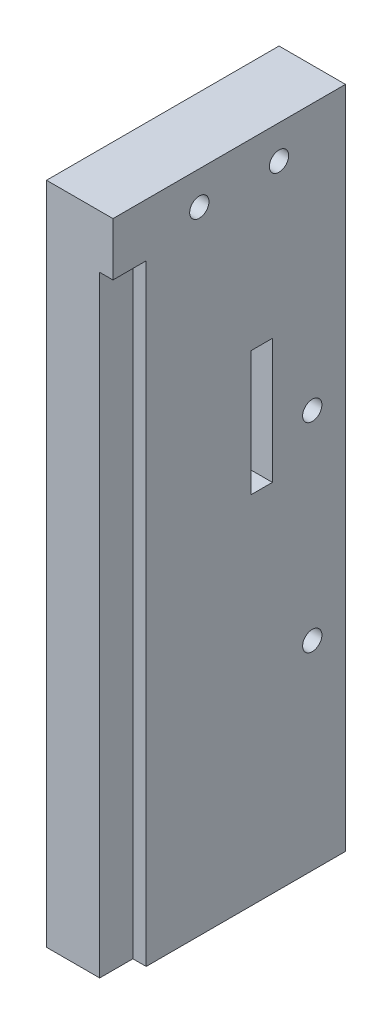
ISO-10303-21;
HEADER;
FILE_DESCRIPTION(('STEP AP214'),'2;1');
FILE_NAME('part.step','',(''),(''),'','','');
FILE_SCHEMA(('AUTOMOTIVE_DESIGN { 1 0 10303 214 1 1 1 1 }'));
ENDSEC;
DATA;
#1=APPLICATION_CONTEXT('core data for automotive mechanical design processes');
#2=APPLICATION_PROTOCOL_DEFINITION('international standard','automotive_design',2000,#1);
#3=PRODUCT_CONTEXT('',#1,'mechanical');
#4=PRODUCT('Part','Part','',(#3));
#5=PRODUCT_RELATED_PRODUCT_CATEGORY('part','',(#4));
#6=PRODUCT_DEFINITION_FORMATION('','',#4);
#7=PRODUCT_DEFINITION_CONTEXT('part definition',#1,'design');
#8=PRODUCT_DEFINITION('design','',#6,#7);
#9=PRODUCT_DEFINITION_SHAPE('','',#8);
#10=(LENGTH_UNIT() NAMED_UNIT(*) SI_UNIT(.MILLI.,.METRE.));
#11=(NAMED_UNIT(*) PLANE_ANGLE_UNIT() SI_UNIT($,.RADIAN.));
#12=(NAMED_UNIT(*) SI_UNIT($,.STERADIAN.) SOLID_ANGLE_UNIT());
#13=UNCERTAINTY_MEASURE_WITH_UNIT(LENGTH_MEASURE(1.E-05),#10,'distance_accuracy_value','');
#14=(GEOMETRIC_REPRESENTATION_CONTEXT(3) GLOBAL_UNCERTAINTY_ASSIGNED_CONTEXT((#13)) GLOBAL_UNIT_ASSIGNED_CONTEXT((#10,
#11,#12)) REPRESENTATION_CONTEXT('',''));
#15=CARTESIAN_POINT('',(0.,0.,0.));
#16=DIRECTION('',(0.,0.,1.));
#17=DIRECTION('',(1.,0.,0.));
#18=AXIS2_PLACEMENT_3D('',#15,#16,#17);
#19=CARTESIAN_POINT('',(-43.4873241053564,-64.0320874471086,-114.348756211209));
#20=DIRECTION('',(0.,-1.,0.));
#21=DIRECTION('',(0.,0.,-1.));
#22=AXIS2_PLACEMENT_3D('',#19,#20,#21);
#23=PLANE('',#22);
#24=CARTESIAN_POINT('',(-48.4873241053564,-64.0320874471086,8.15000000000014));
#25=DIRECTION('',(0.,-1.,0.));
#26=DIRECTION('',(0.,0.,-1.));
#27=AXIS2_PLACEMENT_3D('',#24,#25,#26);
#28=CIRCLE('',#27,2.1);
#29=CARTESIAN_POINT('',(-48.4873241053564,-64.0320874471086,6.05000000000014));
#30=VERTEX_POINT('',#29);
#31=EDGE_CURVE('E205',#30,#30,#28,.T.);
#32=ORIENTED_EDGE('',*,*,#31,.F.);
#33=EDGE_LOOP('',(#32));
#34=FACE_BOUND('',#33,.T.);
#35=CARTESIAN_POINT('',(-48.4873241053564,-64.0320874471086,-3.84999999999986));
#36=DIRECTION('',(0.,-1.,0.));
#37=DIRECTION('',(0.,0.,-1.));
#38=AXIS2_PLACEMENT_3D('',#35,#36,#37);
#39=CIRCLE('',#38,2.1);
#40=CARTESIAN_POINT('',(-48.4873241053564,-64.0320874471086,-5.94999999999986));
#41=VERTEX_POINT('',#40);
#42=EDGE_CURVE('E215',#41,#41,#39,.T.);
#43=ORIENTED_EDGE('',*,*,#42,.F.);
#44=EDGE_LOOP('',(#43));
#45=FACE_BOUND('',#44,.T.);
#46=DIRECTION('',(1.,0.,0.));
#47=VECTOR('',#46,1.);
#48=CARTESIAN_POINT('',(2.86267589464365,-64.0320874471086,16.1500000000001));
#49=LINE('',#48,#47);
#50=CARTESIAN_POINT('',(-45.4873241053564,-64.0320874471086,16.1500000000001));
#51=VERTEX_POINT('',#50);
#52=CARTESIAN_POINT('',(-43.4873241053564,-64.0320874471086,16.1500000000001));
#53=VERTEX_POINT('',#52);
#54=EDGE_CURVE('E236',#51,#53,#49,.T.);
#55=ORIENTED_EDGE('',*,*,#54,.F.);
#56=DIRECTION('',(0.,0.,-1.));
#57=VECTOR('',#56,1.);
#58=CARTESIAN_POINT('',(-45.4873241053564,-64.0320874471086,21.1500000000001));
#59=LINE('',#58,#57);
#60=CARTESIAN_POINT('',(-45.4873241053564,-64.0320874471086,21.1500000000001));
#61=VERTEX_POINT('',#60);
#62=EDGE_CURVE('E233',#61,#51,#59,.T.);
#63=ORIENTED_EDGE('',*,*,#62,.F.);
#64=DIRECTION('',(1.,0.,0.));
#65=VECTOR('',#64,1.);
#66=CARTESIAN_POINT('',(-43.4873241053564,-64.0320874471086,21.1500000000001));
#67=LINE('',#66,#65);
#68=CARTESIAN_POINT('',(-53.4873241053564,-64.0320874471086,21.1500000000001));
#69=VERTEX_POINT('',#68);
#70=EDGE_CURVE('E51',#69,#61,#67,.T.);
#71=ORIENTED_EDGE('',*,*,#70,.F.);
#72=DIRECTION('',(0.,0.,1.));
#73=VECTOR('',#72,1.);
#74=CARTESIAN_POINT('',(-53.4873241053564,-64.0320874471086,-114.348756211209));
#75=LINE('',#74,#73);
#76=CARTESIAN_POINT('',(-53.4873241053564,-64.0320874471086,-13.8499999999999));
#77=VERTEX_POINT('',#76);
#78=EDGE_CURVE('E137',#77,#69,#75,.T.);
#79=ORIENTED_EDGE('',*,*,#78,.F.);
#80=DIRECTION('',(-1.,0.,0.));
#81=VECTOR('',#80,1.);
#82=CARTESIAN_POINT('',(-43.4873241053564,-64.0320874471086,-13.8499999999999));
#83=LINE('',#82,#81);
#84=CARTESIAN_POINT('',(-43.4873241053564,-64.0320874471086,-13.8499999999999));
#85=VERTEX_POINT('',#84);
#86=EDGE_CURVE('E218',#85,#77,#83,.T.);
#87=ORIENTED_EDGE('',*,*,#86,.F.);
#88=DIRECTION('',(0.,0.,-1.));
#89=VECTOR('',#88,1.);
#90=CARTESIAN_POINT('',(-43.4873241053564,-64.0320874471086,16.1500000000001));
#91=LINE('',#90,#89);
#92=EDGE_CURVE('E185',#53,#85,#91,.T.);
#93=ORIENTED_EDGE('',*,*,#92,.F.);
#94=EDGE_LOOP('',(#55,#63,#71,#79,#87,#93));
#95=FACE_BOUND('',#94,.T.);
#96=ADVANCED_FACE('F34',(#34,#45,#95),#23,.T.);
#97=CARTESIAN_POINT('',(-47.7373241053563,8.3579125528914,0.350000000000133));
#98=DIRECTION('',(0.,0.,-1.));
#99=DIRECTION('',(0.,1.,0.));
#100=AXIS2_PLACEMENT_3D('',#97,#98,#99);
#101=PLANE('',#100);
#102=DIRECTION('',(0.,-1.,0.));
#103=VECTOR('',#102,1.);
#104=CARTESIAN_POINT('',(-43.4873241053564,25.9679125528914,0.350000000000136));
#105=LINE('',#104,#103);
#106=CARTESIAN_POINT('',(-43.4873241053564,8.3579125528914,0.350000000000133));
#107=VERTEX_POINT('',#106);
#108=CARTESIAN_POINT('',(-43.4873241053564,-10.4220874471086,0.350000000000132));
#109=VERTEX_POINT('',#108);
#110=EDGE_CURVE('E187',#107,#109,#105,.T.);
#111=ORIENTED_EDGE('',*,*,#110,.T.);
#112=DIRECTION('',(1.,0.,0.));
#113=VECTOR('',#112,1.);
#114=CARTESIAN_POINT('',(-47.7373241053564,-10.4220874471086,0.350000000000131));
#115=LINE('',#114,#113);
#116=CARTESIAN_POINT('',(-47.7373241053564,-10.4220874471086,0.350000000000131));
#117=VERTEX_POINT('',#116);
#118=EDGE_CURVE('E173',#117,#109,#115,.T.);
#119=ORIENTED_EDGE('',*,*,#118,.F.);
#120=DIRECTION('',(0.,1.,0.));
#121=VECTOR('',#120,1.);
#122=CARTESIAN_POINT('',(-47.7373241053563,8.3579125528914,0.350000000000133));
#123=LINE('',#122,#121);
#124=CARTESIAN_POINT('',(-47.7373241053563,8.3579125528914,0.350000000000133));
#125=VERTEX_POINT('',#124);
#126=EDGE_CURVE('E163',#117,#125,#123,.T.);
#127=ORIENTED_EDGE('',*,*,#126,.T.);
#128=DIRECTION('',(1.,0.,0.));
#129=VECTOR('',#128,1.);
#130=CARTESIAN_POINT('',(-47.7373241053563,8.3579125528914,0.350000000000133));
#131=LINE('',#130,#129);
#132=EDGE_CURVE('E170',#125,#107,#131,.T.);
#133=ORIENTED_EDGE('',*,*,#132,.T.);
#134=EDGE_LOOP('',(#111,#119,#127,#133));
#135=FACE_BOUND('',#134,.T.);
#136=ADVANCED_FACE('F313',(#135),#101,.T.);
#137=CARTESIAN_POINT('',(-47.7373241053564,-19.0320874471086,1.32900356321621E-13));
#138=DIRECTION('',(-1.,0.,0.));
#139=DIRECTION('',(0.,-1.,0.));
#140=AXIS2_PLACEMENT_3D('',#137,#138,#139);
#141=PLANE('',#140);
#142=DIRECTION('',(0.,-1.,0.));
#143=VECTOR('',#142,1.);
#144=CARTESIAN_POINT('',(-47.7373241053563,8.3579125528914,-2.84999999999987));
#145=LINE('',#144,#143);
#146=CARTESIAN_POINT('',(-47.7373241053563,8.3579125528914,-2.84999999999987));
#147=VERTEX_POINT('',#146);
#148=CARTESIAN_POINT('',(-47.7373241053564,-10.4220874471086,-2.84999999999987));
#149=VERTEX_POINT('',#148);
#150=EDGE_CURVE('E152',#147,#149,#145,.T.);
#151=ORIENTED_EDGE('',*,*,#150,.F.);
#152=DIRECTION('',(0.,0.,-1.));
#153=VECTOR('',#152,1.);
#154=CARTESIAN_POINT('',(-47.7373241053563,8.3579125528914,-2.84999999999987));
#155=LINE('',#154,#153);
#156=EDGE_CURVE('E165',#125,#147,#155,.T.);
#157=ORIENTED_EDGE('',*,*,#156,.F.);
#158=ORIENTED_EDGE('',*,*,#126,.F.);
#159=DIRECTION('',(0.,0.,1.));
#160=VECTOR('',#159,1.);
#161=CARTESIAN_POINT('',(-47.7373241053564,-10.4220874471086,-2.84999999999987));
#162=LINE('',#161,#160);
#163=EDGE_CURVE('E156',#149,#117,#162,.T.);
#164=ORIENTED_EDGE('',*,*,#163,.F.);
#165=EDGE_LOOP('',(#151,#157,#158,#164));
#166=FACE_BOUND('',#165,.T.);
#167=ADVANCED_FACE('F319',(#166),#141,.F.);
#168=CARTESIAN_POINT('',(-51.5873241053564,32.4179125528914,-3.84999999999986));
#169=DIRECTION('',(1.,0.,0.));
#170=DIRECTION('',(0.,0.,-1.));
#171=AXIS2_PLACEMENT_3D('',#168,#169,#170);
#172=PLANE('',#171);
#173=CARTESIAN_POINT('',(-51.5873241053564,30.9679125528914,-3.84999999999986));
#174=DIRECTION('',(-1.,0.,0.));
#175=DIRECTION('',(0.,0.,1.));
#176=AXIS2_PLACEMENT_3D('',#173,#174,#175);
#177=CIRCLE('',#176,1.44999999999999);
#178=CARTESIAN_POINT('',(-51.5873241053564,30.9679125528914,-2.39999999999987));
#179=VERTEX_POINT('',#178);
#180=EDGE_CURVE('E272',#179,#179,#177,.T.);
#181=ORIENTED_EDGE('',*,*,#180,.F.);
#182=EDGE_LOOP('',(#181));
#183=FACE_BOUND('',#182,.T.);
#184=CARTESIAN_POINT('',(-51.5873241053564,30.9679125528914,-3.84999999999986));
#185=DIRECTION('',(-1.,0.,0.));
#186=DIRECTION('',(0.,0.,1.));
#187=AXIS2_PLACEMENT_3D('',#184,#185,#186);
#188=CIRCLE('',#187,2.47499999999999);
#189=CARTESIAN_POINT('',(-51.5873241053564,30.9679125528914,-1.37499999999987));
#190=VERTEX_POINT('',#189);
#191=EDGE_CURVE('E269',#190,#190,#188,.T.);
#192=ORIENTED_EDGE('',*,*,#191,.T.);
#193=EDGE_LOOP('',(#192));
#194=FACE_BOUND('',#193,.T.);
#195=ADVANCED_FACE('F364',(#183,#194),#172,.F.);
#196=CARTESIAN_POINT('',(-53.4873241053564,30.9679125528914,-3.84999999999986));
#197=DIRECTION('',(-1.,0.,0.));
#198=DIRECTION('',(0.,0.,1.));
#199=AXIS2_PLACEMENT_3D('',#196,#197,#198);
#200=CYLINDRICAL_SURFACE('',#199,1.44999999999999);
#201=CARTESIAN_POINT('',(-43.4873241053564,30.9679125528914,-3.84999999999986));
#202=DIRECTION('',(1.,0.,0.));
#203=DIRECTION('',(0.,0.,-1.));
#204=AXIS2_PLACEMENT_3D('',#201,#202,#203);
#205=CIRCLE('',#204,1.44999999999999);
#206=CARTESIAN_POINT('',(-43.4873241053564,30.9679125528914,-5.29999999999986));
#207=VERTEX_POINT('',#206);
#208=EDGE_CURVE('E11',#207,#207,#205,.F.);
#209=ORIENTED_EDGE('',*,*,#208,.F.);
#210=EDGE_LOOP('',(#209));
#211=FACE_BOUND('',#210,.T.);
#212=ORIENTED_EDGE('',*,*,#180,.T.);
#213=EDGE_LOOP('',(#212));
#214=FACE_BOUND('',#213,.T.);
#215=ADVANCED_FACE('F362',(#211,#214),#200,.F.);
#216=CARTESIAN_POINT('',(-53.4873241053564,30.9679125528914,-3.84999999999986));
#217=DIRECTION('',(-1.,0.,0.));
#218=DIRECTION('',(0.,0.,1.));
#219=AXIS2_PLACEMENT_3D('',#216,#217,#218);
#220=CYLINDRICAL_SURFACE('',#219,2.47499999999999);
#221=ORIENTED_EDGE('',*,*,#191,.F.);
#222=EDGE_LOOP('',(#221));
#223=FACE_BOUND('',#222,.T.);
#224=CARTESIAN_POINT('',(-53.4873241053564,30.9679125528914,-3.84999999999986));
#225=DIRECTION('',(-1.,0.,0.));
#226=DIRECTION('',(0.,0.,1.));
#227=AXIS2_PLACEMENT_3D('',#224,#225,#226);
#228=CIRCLE('',#227,2.47499999999999);
#229=CARTESIAN_POINT('',(-53.4873241053564,30.9679125528914,-1.37499999999987));
#230=VERTEX_POINT('',#229);
#231=EDGE_CURVE('E266',#230,#230,#228,.T.);
#232=ORIENTED_EDGE('',*,*,#231,.T.);
#233=EDGE_LOOP('',(#232));
#234=FACE_BOUND('',#233,.T.);
#235=ADVANCED_FACE('F355',(#223,#234),#220,.F.);
#236=CARTESIAN_POINT('',(-51.5873241053564,32.4179125528914,8.15000000000014));
#237=DIRECTION('',(1.,0.,0.));
#238=DIRECTION('',(0.,0.,-1.));
#239=AXIS2_PLACEMENT_3D('',#236,#237,#238);
#240=PLANE('',#239);
#241=CARTESIAN_POINT('',(-51.5873241053564,30.9679125528914,8.15000000000014));
#242=DIRECTION('',(-1.,0.,0.));
#243=DIRECTION('',(0.,0.,1.));
#244=AXIS2_PLACEMENT_3D('',#241,#242,#243);
#245=CIRCLE('',#244,1.44999999999999);
#246=CARTESIAN_POINT('',(-51.5873241053564,30.9679125528914,9.60000000000013));
#247=VERTEX_POINT('',#246);
#248=EDGE_CURVE('E263',#247,#247,#245,.T.);
#249=ORIENTED_EDGE('',*,*,#248,.F.);
#250=EDGE_LOOP('',(#249));
#251=FACE_BOUND('',#250,.T.);
#252=CARTESIAN_POINT('',(-51.5873241053564,30.9679125528914,8.15000000000014));
#253=DIRECTION('',(-1.,0.,0.));
#254=DIRECTION('',(0.,0.,1.));
#255=AXIS2_PLACEMENT_3D('',#252,#253,#254);
#256=CIRCLE('',#255,2.475);
#257=CARTESIAN_POINT('',(-51.5873241053564,30.9679125528914,10.6250000000001));
#258=VERTEX_POINT('',#257);
#259=EDGE_CURVE('E260',#258,#258,#256,.T.);
#260=ORIENTED_EDGE('',*,*,#259,.T.);
#261=EDGE_LOOP('',(#260));
#262=FACE_BOUND('',#261,.T.);
#263=ADVANCED_FACE('F352',(#251,#262),#240,.F.);
#264=CARTESIAN_POINT('',(-53.4873241053564,30.9679125528914,8.15000000000014));
#265=DIRECTION('',(-1.,0.,0.));
#266=DIRECTION('',(0.,0.,1.));
#267=AXIS2_PLACEMENT_3D('',#264,#265,#266);
#268=CYLINDRICAL_SURFACE('',#267,1.44999999999999);
#269=CARTESIAN_POINT('',(-43.4873241053564,30.9679125528914,8.15000000000014));
#270=DIRECTION('',(1.,0.,0.));
#271=DIRECTION('',(0.,0.,-1.));
#272=AXIS2_PLACEMENT_3D('',#269,#270,#271);
#273=CIRCLE('',#272,1.44999999999999);
#274=CARTESIAN_POINT('',(-43.4873241053564,30.9679125528914,6.70000000000014));
#275=VERTEX_POINT('',#274);
#276=EDGE_CURVE('E43',#275,#275,#273,.F.);
#277=ORIENTED_EDGE('',*,*,#276,.F.);
#278=EDGE_LOOP('',(#277));
#279=FACE_BOUND('',#278,.T.);
#280=ORIENTED_EDGE('',*,*,#248,.T.);
#281=EDGE_LOOP('',(#280));
#282=FACE_BOUND('',#281,.T.);
#283=ADVANCED_FACE('F350',(#279,#282),#268,.F.);
#284=CARTESIAN_POINT('',(-53.4873241053564,30.9679125528914,8.15000000000014));
#285=DIRECTION('',(-1.,0.,0.));
#286=DIRECTION('',(0.,0.,1.));
#287=AXIS2_PLACEMENT_3D('',#284,#285,#286);
#288=CYLINDRICAL_SURFACE('',#287,2.475);
#289=ORIENTED_EDGE('',*,*,#259,.F.);
#290=EDGE_LOOP('',(#289));
#291=FACE_BOUND('',#290,.T.);
#292=CARTESIAN_POINT('',(-53.4873241053564,30.9679125528914,8.15000000000014));
#293=DIRECTION('',(-1.,0.,0.));
#294=DIRECTION('',(0.,0.,1.));
#295=AXIS2_PLACEMENT_3D('',#292,#293,#294);
#296=CIRCLE('',#295,2.475);
#297=CARTESIAN_POINT('',(-53.4873241053564,30.9679125528914,10.6250000000001));
#298=VERTEX_POINT('',#297);
#299=EDGE_CURVE('E257',#298,#298,#296,.T.);
#300=ORIENTED_EDGE('',*,*,#299,.T.);
#301=EDGE_LOOP('',(#300));
#302=FACE_BOUND('',#301,.T.);
#303=ADVANCED_FACE('F343',(#291,#302),#288,.F.);
#304=CARTESIAN_POINT('',(-51.5873241053564,-32.5820874471086,-8.84999999999986));
#305=DIRECTION('',(1.,0.,0.));
#306=DIRECTION('',(0.,0.,-1.));
#307=AXIS2_PLACEMENT_3D('',#304,#305,#306);
#308=PLANE('',#307);
#309=CARTESIAN_POINT('',(-51.5873241053564,-34.0320874471086,-8.84999999999986));
#310=DIRECTION('',(-1.,0.,0.));
#311=DIRECTION('',(0.,0.,1.));
#312=AXIS2_PLACEMENT_3D('',#309,#310,#311);
#313=CIRCLE('',#312,1.44999999999999);
#314=CARTESIAN_POINT('',(-51.5873241053564,-34.0320874471086,-7.39999999999987));
#315=VERTEX_POINT('',#314);
#316=EDGE_CURVE('E254',#315,#315,#313,.T.);
#317=ORIENTED_EDGE('',*,*,#316,.F.);
#318=EDGE_LOOP('',(#317));
#319=FACE_BOUND('',#318,.T.);
#320=CARTESIAN_POINT('',(-51.5873241053564,-34.0320874471086,-8.84999999999986));
#321=DIRECTION('',(-1.,0.,0.));
#322=DIRECTION('',(0.,0.,1.));
#323=AXIS2_PLACEMENT_3D('',#320,#321,#322);
#324=CIRCLE('',#323,2.47499999999999);
#325=CARTESIAN_POINT('',(-51.5873241053564,-34.0320874471086,-6.37499999999987));
#326=VERTEX_POINT('',#325);
#327=EDGE_CURVE('E251',#326,#326,#324,.T.);
#328=ORIENTED_EDGE('',*,*,#327,.T.);
#329=EDGE_LOOP('',(#328));
#330=FACE_BOUND('',#329,.T.);
#331=ADVANCED_FACE('F340',(#319,#330),#308,.F.);
#332=CARTESIAN_POINT('',(-53.4873241053564,-34.0320874471086,-8.84999999999986));
#333=DIRECTION('',(-1.,0.,0.));
#334=DIRECTION('',(0.,0.,1.));
#335=AXIS2_PLACEMENT_3D('',#332,#333,#334);
#336=CYLINDRICAL_SURFACE('',#335,1.44999999999999);
#337=CARTESIAN_POINT('',(-43.4873241053564,-34.0320874471086,-8.84999999999986));
#338=DIRECTION('',(1.,0.,0.));
#339=DIRECTION('',(0.,0.,-1.));
#340=AXIS2_PLACEMENT_3D('',#337,#338,#339);
#341=CIRCLE('',#340,1.44999999999999);
#342=CARTESIAN_POINT('',(-43.4873241053564,-34.0320874471086,-10.2999999999999));
#343=VERTEX_POINT('',#342);
#344=EDGE_CURVE('E197',#343,#343,#341,.F.);
#345=ORIENTED_EDGE('',*,*,#344,.F.);
#346=EDGE_LOOP('',(#345));
#347=FACE_BOUND('',#346,.T.);
#348=ORIENTED_EDGE('',*,*,#316,.T.);
#349=EDGE_LOOP('',(#348));
#350=FACE_BOUND('',#349,.T.);
#351=ADVANCED_FACE('F338',(#347,#350),#336,.F.);
#352=CARTESIAN_POINT('',(-53.4873241053564,-34.0320874471086,-8.84999999999986));
#353=DIRECTION('',(-1.,0.,0.));
#354=DIRECTION('',(0.,0.,1.));
#355=AXIS2_PLACEMENT_3D('',#352,#353,#354);
#356=CYLINDRICAL_SURFACE('',#355,2.47499999999999);
#357=ORIENTED_EDGE('',*,*,#327,.F.);
#358=EDGE_LOOP('',(#357));
#359=FACE_BOUND('',#358,.T.);
#360=CARTESIAN_POINT('',(-53.4873241053564,-34.0320874471086,-8.84999999999986));
#361=DIRECTION('',(-1.,0.,0.));
#362=DIRECTION('',(0.,0.,1.));
#363=AXIS2_PLACEMENT_3D('',#360,#361,#362);
#364=CIRCLE('',#363,2.47499999999999);
#365=CARTESIAN_POINT('',(-53.4873241053564,-34.0320874471086,-6.37499999999987));
#366=VERTEX_POINT('',#365);
#367=EDGE_CURVE('E248',#366,#366,#364,.T.);
#368=ORIENTED_EDGE('',*,*,#367,.T.);
#369=EDGE_LOOP('',(#368));
#370=FACE_BOUND('',#369,.T.);
#371=ADVANCED_FACE('F331',(#359,#370),#356,.F.);
#372=CARTESIAN_POINT('',(-51.5873241053564,-2.58208744710861,-8.84999999999986));
#373=DIRECTION('',(1.,0.,0.));
#374=DIRECTION('',(0.,0.,-1.));
#375=AXIS2_PLACEMENT_3D('',#372,#373,#374);
#376=PLANE('',#375);
#377=CARTESIAN_POINT('',(-51.5873241053564,-4.0320874471086,-8.84999999999986));
#378=DIRECTION('',(-1.,0.,0.));
#379=DIRECTION('',(0.,0.,1.));
#380=AXIS2_PLACEMENT_3D('',#377,#378,#379);
#381=CIRCLE('',#380,1.44999999999999);
#382=CARTESIAN_POINT('',(-51.5873241053564,-4.0320874471086,-7.39999999999987));
#383=VERTEX_POINT('',#382);
#384=EDGE_CURVE('E245',#383,#383,#381,.T.);
#385=ORIENTED_EDGE('',*,*,#384,.F.);
#386=EDGE_LOOP('',(#385));
#387=FACE_BOUND('',#386,.T.);
#388=CARTESIAN_POINT('',(-51.5873241053564,-4.0320874471086,-8.84999999999986));
#389=DIRECTION('',(-1.,0.,0.));
#390=DIRECTION('',(0.,0.,1.));
#391=AXIS2_PLACEMENT_3D('',#388,#389,#390);
#392=CIRCLE('',#391,2.47499999999999);
#393=CARTESIAN_POINT('',(-51.5873241053564,-4.0320874471086,-6.37499999999987));
#394=VERTEX_POINT('',#393);
#395=EDGE_CURVE('E242',#394,#394,#392,.T.);
#396=ORIENTED_EDGE('',*,*,#395,.T.);
#397=EDGE_LOOP('',(#396));
#398=FACE_BOUND('',#397,.T.);
#399=ADVANCED_FACE('F328',(#387,#398),#376,.F.);
#400=CARTESIAN_POINT('',(-53.4873241053564,-4.0320874471086,-8.84999999999986));
#401=DIRECTION('',(-1.,0.,0.));
#402=DIRECTION('',(0.,0.,1.));
#403=AXIS2_PLACEMENT_3D('',#400,#401,#402);
#404=CYLINDRICAL_SURFACE('',#403,1.44999999999999);
#405=CARTESIAN_POINT('',(-43.4873241053564,-4.0320874471086,-8.84999999999986));
#406=DIRECTION('',(1.,0.,0.));
#407=DIRECTION('',(0.,0.,-1.));
#408=AXIS2_PLACEMENT_3D('',#405,#406,#407);
#409=CIRCLE('',#408,1.44999999999999);
#410=CARTESIAN_POINT('',(-43.4873241053564,-4.0320874471086,-10.2999999999999));
#411=VERTEX_POINT('',#410);
#412=EDGE_CURVE('E195',#411,#411,#409,.F.);
#413=ORIENTED_EDGE('',*,*,#412,.F.);
#414=EDGE_LOOP('',(#413));
#415=FACE_BOUND('',#414,.T.);
#416=ORIENTED_EDGE('',*,*,#384,.T.);
#417=EDGE_LOOP('',(#416));
#418=FACE_BOUND('',#417,.T.);
#419=ADVANCED_FACE('F307',(#415,#418),#404,.F.);
#420=CARTESIAN_POINT('',(-53.4873241053564,-4.0320874471086,-8.84999999999986));
#421=DIRECTION('',(-1.,0.,0.));
#422=DIRECTION('',(0.,0.,1.));
#423=AXIS2_PLACEMENT_3D('',#420,#421,#422);
#424=CYLINDRICAL_SURFACE('',#423,2.47499999999999);
#425=ORIENTED_EDGE('',*,*,#395,.F.);
#426=EDGE_LOOP('',(#425));
#427=FACE_BOUND('',#426,.T.);
#428=CARTESIAN_POINT('',(-53.4873241053564,-4.0320874471086,-8.84999999999986));
#429=DIRECTION('',(-1.,0.,0.));
#430=DIRECTION('',(0.,0.,1.));
#431=AXIS2_PLACEMENT_3D('',#428,#429,#430);
#432=CIRCLE('',#431,2.47499999999999);
#433=CARTESIAN_POINT('',(-53.4873241053564,-4.0320874471086,-6.37499999999987));
#434=VERTEX_POINT('',#433);
#435=EDGE_CURVE('E239',#434,#434,#432,.T.);
#436=ORIENTED_EDGE('',*,*,#435,.T.);
#437=EDGE_LOOP('',(#436));
#438=FACE_BOUND('',#437,.T.);
#439=ADVANCED_FACE('F301',(#427,#438),#424,.F.);
#440=CARTESIAN_POINT('',(-53.4873241053564,35.9679125528914,-13.8499999999999));
#441=DIRECTION('',(-1.,0.,0.));
#442=DIRECTION('',(0.,-1.,0.));
#443=AXIS2_PLACEMENT_3D('',#440,#441,#442);
#444=PLANE('',#443);
#445=ORIENTED_EDGE('',*,*,#435,.F.);
#446=EDGE_LOOP('',(#445));
#447=FACE_BOUND('',#446,.T.);
#448=ORIENTED_EDGE('',*,*,#367,.F.);
#449=EDGE_LOOP('',(#448));
#450=FACE_BOUND('',#449,.T.);
#451=ORIENTED_EDGE('',*,*,#299,.F.);
#452=EDGE_LOOP('',(#451));
#453=FACE_BOUND('',#452,.T.);
#454=ORIENTED_EDGE('',*,*,#231,.F.);
#455=EDGE_LOOP('',(#454));
#456=FACE_BOUND('',#455,.T.);
#457=DIRECTION('',(0.,-1.,0.));
#458=VECTOR('',#457,1.);
#459=CARTESIAN_POINT('',(-53.4873241053564,35.9679125528914,-13.8499999999999));
#460=LINE('',#459,#458);
#461=CARTESIAN_POINT('',(-53.4873241053564,35.9679125528914,-13.8499999999999));
#462=VERTEX_POINT('',#461);
#463=EDGE_CURVE('E189',#462,#77,#460,.T.);
#464=ORIENTED_EDGE('',*,*,#463,.T.);
#465=ORIENTED_EDGE('',*,*,#78,.T.);
#466=DIRECTION('',(0.,-1.,0.));
#467=VECTOR('',#466,1.);
#468=CARTESIAN_POINT('',(-53.4873241053564,35.9679125528914,21.1500000000001));
#469=LINE('',#468,#467);
#470=CARTESIAN_POINT('',(-53.4873241053564,35.9679125528914,21.1500000000001));
#471=VERTEX_POINT('',#470);
#472=EDGE_CURVE('E153',#471,#69,#469,.T.);
#473=ORIENTED_EDGE('',*,*,#472,.F.);
#474=DIRECTION('',(0.,0.,1.));
#475=VECTOR('',#474,1.);
#476=CARTESIAN_POINT('',(-53.4873241053564,35.9679125528914,-13.8499999999999));
#477=LINE('',#476,#475);
#478=EDGE_CURVE('E150',#462,#471,#477,.T.);
#479=ORIENTED_EDGE('',*,*,#478,.F.);
#480=EDGE_LOOP('',(#464,#465,#473,#479));
#481=FACE_BOUND('',#480,.T.);
#482=ADVANCED_FACE('F36',(#447,#450,#453,#456,#481),#444,.T.);
#483=CARTESIAN_POINT('',(-53.4873241053564,35.9679125528914,-13.8499999999999));
#484=DIRECTION('',(0.,1.,0.));
#485=DIRECTION('',(0.,0.,1.));
#486=AXIS2_PLACEMENT_3D('',#483,#484,#485);
#487=PLANE('',#486);
#488=DIRECTION('',(-1.,0.,0.));
#489=VECTOR('',#488,1.);
#490=CARTESIAN_POINT('',(-53.4873241053564,35.9679125528914,21.1500000000001));
#491=LINE('',#490,#489);
#492=CARTESIAN_POINT('',(-43.4873241053564,35.9679125528914,21.1500000000001));
#493=VERTEX_POINT('',#492);
#494=EDGE_CURVE('E143',#493,#471,#491,.T.);
#495=ORIENTED_EDGE('',*,*,#494,.F.);
#496=DIRECTION('',(0.,0.,1.));
#497=VECTOR('',#496,1.);
#498=CARTESIAN_POINT('',(-43.4873241053564,35.9679125528914,-114.348756211209));
#499=LINE('',#498,#497);
#500=CARTESIAN_POINT('',(-43.4873241053564,35.9679125528914,-13.8499999999999));
#501=VERTEX_POINT('',#500);
#502=EDGE_CURVE('E125',#501,#493,#499,.T.);
#503=ORIENTED_EDGE('',*,*,#502,.F.);
#504=DIRECTION('',(-1.,0.,0.));
#505=VECTOR('',#504,1.);
#506=CARTESIAN_POINT('',(-53.4873241053564,35.9679125528914,-13.8499999999999));
#507=LINE('',#506,#505);
#508=EDGE_CURVE('E192',#501,#462,#507,.T.);
#509=ORIENTED_EDGE('',*,*,#508,.T.);
#510=ORIENTED_EDGE('',*,*,#478,.T.);
#511=EDGE_LOOP('',(#495,#503,#509,#510));
#512=FACE_BOUND('',#511,.T.);
#513=ADVANCED_FACE('F148',(#512),#487,.T.);
#514=CARTESIAN_POINT('',(2.86267589464365,-19.0320874471086,-13.8499999999999));
#515=DIRECTION('',(0.,0.,1.));
#516=DIRECTION('',(1.,0.,0.));
#517=AXIS2_PLACEMENT_3D('',#514,#515,#516);
#518=PLANE('',#517);
#519=DIRECTION('',(0.,-1.,0.));
#520=VECTOR('',#519,1.);
#521=CARTESIAN_POINT('',(-43.4873241053564,-64.0320874471086,-13.8499999999999));
#522=LINE('',#521,#520);
#523=EDGE_CURVE('E133',#501,#85,#522,.T.);
#524=ORIENTED_EDGE('',*,*,#523,.T.);
#525=ORIENTED_EDGE('',*,*,#86,.T.);
#526=ORIENTED_EDGE('',*,*,#463,.F.);
#527=ORIENTED_EDGE('',*,*,#508,.F.);
#528=EDGE_LOOP('',(#524,#525,#526,#527));
#529=FACE_BOUND('',#528,.T.);
#530=ADVANCED_FACE('F298',(#529),#518,.F.);
#531=CARTESIAN_POINT('',(-45.4873241053564,27.9679125528914,21.1500000000001));
#532=DIRECTION('',(0.,-1.,0.));
#533=DIRECTION('',(0.,0.,-1.));
#534=AXIS2_PLACEMENT_3D('',#531,#532,#533);
#535=PLANE('',#534);
#536=DIRECTION('',(-1.,0.,0.));
#537=VECTOR('',#536,1.);
#538=CARTESIAN_POINT('',(-45.4873241053564,27.9679125528914,16.1500000000001));
#539=LINE('',#538,#537);
#540=CARTESIAN_POINT('',(-43.4873241053564,27.9679125528914,16.1500000000001));
#541=VERTEX_POINT('',#540);
#542=CARTESIAN_POINT('',(-45.4873241053564,27.9679125528914,16.1500000000001));
#543=VERTEX_POINT('',#542);
#544=EDGE_CURVE('E59',#541,#543,#539,.T.);
#545=ORIENTED_EDGE('',*,*,#544,.F.);
#546=DIRECTION('',(0.,0.,1.));
#547=VECTOR('',#546,1.);
#548=CARTESIAN_POINT('',(-43.4873241053564,27.9679125528914,21.1500000000001));
#549=LINE('',#548,#547);
#550=CARTESIAN_POINT('',(-43.4873241053564,27.9679125528914,21.1500000000001));
#551=VERTEX_POINT('',#550);
#552=EDGE_CURVE('E221',#541,#551,#549,.T.);
#553=ORIENTED_EDGE('',*,*,#552,.T.);
#554=DIRECTION('',(-1.,0.,0.));
#555=VECTOR('',#554,1.);
#556=CARTESIAN_POINT('',(-45.4873241053564,27.9679125528914,21.1500000000001));
#557=LINE('',#556,#555);
#558=CARTESIAN_POINT('',(-45.4873241053564,27.9679125528914,21.1500000000001));
#559=VERTEX_POINT('',#558);
#560=EDGE_CURVE('E146',#551,#559,#557,.T.);
#561=ORIENTED_EDGE('',*,*,#560,.T.);
#562=DIRECTION('',(0.,0.,-1.));
#563=VECTOR('',#562,1.);
#564=CARTESIAN_POINT('',(-45.4873241053564,27.9679125528914,21.1500000000001));
#565=LINE('',#564,#563);
#566=EDGE_CURVE('E158',#559,#543,#565,.T.);
#567=ORIENTED_EDGE('',*,*,#566,.T.);
#568=EDGE_LOOP('',(#545,#553,#561,#567));
#569=FACE_BOUND('',#568,.T.);
#570=ADVANCED_FACE('F290',(#569),#535,.T.);
#571=CARTESIAN_POINT('',(-45.4873241053564,27.9679125528914,21.1500000000001));
#572=DIRECTION('',(1.,0.,0.));
#573=DIRECTION('',(0.,1.,0.));
#574=AXIS2_PLACEMENT_3D('',#571,#572,#573);
#575=PLANE('',#574);
#576=DIRECTION('',(0.,-1.,0.));
#577=VECTOR('',#576,1.);
#578=CARTESIAN_POINT('',(-45.4873241053564,27.9679125528914,21.1500000000001));
#579=LINE('',#578,#577);
#580=EDGE_CURVE('E282',#559,#61,#579,.T.);
#581=ORIENTED_EDGE('',*,*,#580,.T.);
#582=ORIENTED_EDGE('',*,*,#62,.T.);
#583=DIRECTION('',(0.,-1.,0.));
#584=VECTOR('',#583,1.);
#585=CARTESIAN_POINT('',(-45.4873241053564,27.9679125528914,16.1500000000001));
#586=LINE('',#585,#584);
#587=EDGE_CURVE('E281',#543,#51,#586,.T.);
#588=ORIENTED_EDGE('',*,*,#587,.F.);
#589=ORIENTED_EDGE('',*,*,#566,.F.);
#590=EDGE_LOOP('',(#581,#582,#588,#589));
#591=FACE_BOUND('',#590,.T.);
#592=ADVANCED_FACE('F292',(#591),#575,.T.);
#593=CARTESIAN_POINT('',(2.86267589464365,-19.0320874471086,21.1500000000001));
#594=DIRECTION('',(0.,0.,1.));
#595=DIRECTION('',(1.,0.,0.));
#596=AXIS2_PLACEMENT_3D('',#593,#594,#595);
#597=PLANE('',#596);
#598=ORIENTED_EDGE('',*,*,#560,.F.);
#599=DIRECTION('',(0.,1.,0.));
#600=VECTOR('',#599,1.);
#601=CARTESIAN_POINT('',(-43.4873241053564,-64.0320874471086,21.1500000000001));
#602=LINE('',#601,#600);
#603=EDGE_CURVE('E130',#551,#493,#602,.T.);
#604=ORIENTED_EDGE('',*,*,#603,.T.);
#605=ORIENTED_EDGE('',*,*,#494,.T.);
#606=ORIENTED_EDGE('',*,*,#472,.T.);
#607=ORIENTED_EDGE('',*,*,#70,.T.);
#608=ORIENTED_EDGE('',*,*,#580,.F.);
#609=EDGE_LOOP('',(#598,#604,#605,#606,#607,#608));
#610=FACE_BOUND('',#609,.T.);
#611=ADVANCED_FACE('F141',(#610),#597,.T.);
#612=CARTESIAN_POINT('',(-47.7373241053563,8.3579125528914,-2.84999999999987));
#613=DIRECTION('',(0.,-1.,0.));
#614=DIRECTION('',(1.,0.,0.));
#615=AXIS2_PLACEMENT_3D('',#612,#613,#614);
#616=PLANE('',#615);
#617=DIRECTION('',(1.,0.,0.));
#618=VECTOR('',#617,1.);
#619=CARTESIAN_POINT('',(-47.7373241053563,8.3579125528914,-2.84999999999987));
#620=LINE('',#619,#618);
#621=CARTESIAN_POINT('',(-43.4873241053564,8.3579125528914,-2.84999999999987));
#622=VERTEX_POINT('',#621);
#623=EDGE_CURVE('E167',#147,#622,#620,.T.);
#624=ORIENTED_EDGE('',*,*,#623,.T.);
#625=DIRECTION('',(0.,0.,1.));
#626=VECTOR('',#625,1.);
#627=CARTESIAN_POINT('',(-43.4873241053564,8.3579125528914,16.1500000000001));
#628=LINE('',#627,#626);
#629=EDGE_CURVE('E179',#622,#107,#628,.T.);
#630=ORIENTED_EDGE('',*,*,#629,.T.);
#631=ORIENTED_EDGE('',*,*,#132,.F.);
#632=ORIENTED_EDGE('',*,*,#156,.T.);
#633=EDGE_LOOP('',(#624,#630,#631,#632));
#634=FACE_BOUND('',#633,.T.);
#635=ADVANCED_FACE('F394',(#634),#616,.T.);
#636=CARTESIAN_POINT('',(-47.7373241053564,-10.4220874471086,-2.84999999999987));
#637=DIRECTION('',(0.,1.,0.));
#638=DIRECTION('',(-1.,0.,0.));
#639=AXIS2_PLACEMENT_3D('',#636,#637,#638);
#640=PLANE('',#639);
#641=DIRECTION('',(0.,0.,-1.));
#642=VECTOR('',#641,1.);
#643=CARTESIAN_POINT('',(-43.4873241053564,-10.4220874471086,16.1500000000001));
#644=LINE('',#643,#642);
#645=CARTESIAN_POINT('',(-43.4873241053564,-10.4220874471086,-2.84999999999987));
#646=VERTEX_POINT('',#645);
#647=EDGE_CURVE('E181',#109,#646,#644,.T.);
#648=ORIENTED_EDGE('',*,*,#647,.T.);
#649=DIRECTION('',(1.,0.,0.));
#650=VECTOR('',#649,1.);
#651=CARTESIAN_POINT('',(-47.7373241053564,-10.4220874471086,-2.84999999999987));
#652=LINE('',#651,#650);
#653=EDGE_CURVE('E176',#149,#646,#652,.T.);
#654=ORIENTED_EDGE('',*,*,#653,.F.);
#655=ORIENTED_EDGE('',*,*,#163,.T.);
#656=ORIENTED_EDGE('',*,*,#118,.T.);
#657=EDGE_LOOP('',(#648,#654,#655,#656));
#658=FACE_BOUND('',#657,.T.);
#659=ADVANCED_FACE('F399',(#658),#640,.T.);
#660=CARTESIAN_POINT('',(-47.7373241053563,8.3579125528914,-2.84999999999987));
#661=DIRECTION('',(0.,0.,1.));
#662=DIRECTION('',(0.,-1.,0.));
#663=AXIS2_PLACEMENT_3D('',#660,#661,#662);
#664=PLANE('',#663);
#665=ORIENTED_EDGE('',*,*,#653,.T.);
#666=DIRECTION('',(0.,1.,0.));
#667=VECTOR('',#666,1.);
#668=CARTESIAN_POINT('',(-43.4873241053564,8.3579125528914,-2.84999999999987));
#669=LINE('',#668,#667);
#670=EDGE_CURVE('E230',#646,#622,#669,.T.);
#671=ORIENTED_EDGE('',*,*,#670,.T.);
#672=ORIENTED_EDGE('',*,*,#623,.F.);
#673=ORIENTED_EDGE('',*,*,#150,.T.);
#674=EDGE_LOOP('',(#665,#671,#672,#673));
#675=FACE_BOUND('',#674,.T.);
#676=ADVANCED_FACE('F404',(#675),#664,.T.);
#677=CARTESIAN_POINT('',(-43.4873241053564,25.9679125528914,16.1500000000001));
#678=DIRECTION('',(-1.,0.,0.));
#679=DIRECTION('',(0.,0.,1.));
#680=AXIS2_PLACEMENT_3D('',#677,#678,#679);
#681=PLANE('',#680);
#682=ORIENTED_EDGE('',*,*,#670,.F.);
#683=ORIENTED_EDGE('',*,*,#647,.F.);
#684=ORIENTED_EDGE('',*,*,#110,.F.);
#685=ORIENTED_EDGE('',*,*,#629,.F.);
#686=EDGE_LOOP('',(#682,#683,#684,#685));
#687=FACE_BOUND('',#686,.T.);
#688=ORIENTED_EDGE('',*,*,#92,.T.);
#689=ORIENTED_EDGE('',*,*,#523,.F.);
#690=ORIENTED_EDGE('',*,*,#502,.T.);
#691=ORIENTED_EDGE('',*,*,#603,.F.);
#692=ORIENTED_EDGE('',*,*,#552,.F.);
#693=DIRECTION('',(0.,1.,0.));
#694=VECTOR('',#693,1.);
#695=CARTESIAN_POINT('',(-43.4873241053564,25.9679125528914,16.1500000000001));
#696=LINE('',#695,#694);
#697=EDGE_CURVE('E183',#53,#541,#696,.T.);
#698=ORIENTED_EDGE('',*,*,#697,.F.);
#699=EDGE_LOOP('',(#688,#689,#690,#691,#692,#698));
#700=FACE_BOUND('',#699,.T.);
#701=ORIENTED_EDGE('',*,*,#276,.T.);
#702=EDGE_LOOP('',(#701));
#703=FACE_BOUND('',#702,.T.);
#704=ORIENTED_EDGE('',*,*,#412,.T.);
#705=EDGE_LOOP('',(#704));
#706=FACE_BOUND('',#705,.T.);
#707=ORIENTED_EDGE('',*,*,#344,.T.);
#708=EDGE_LOOP('',(#707));
#709=FACE_BOUND('',#708,.T.);
#710=ORIENTED_EDGE('',*,*,#208,.T.);
#711=EDGE_LOOP('',(#710));
#712=FACE_BOUND('',#711,.T.);
#713=ADVANCED_FACE('F127',(#687,#700,#703,#706,#709,#712),#681,.F.);
#714=CARTESIAN_POINT('',(2.86267589464365,-19.0320874471086,16.1500000000001));
#715=DIRECTION('',(0.,0.,1.));
#716=DIRECTION('',(1.,0.,0.));
#717=AXIS2_PLACEMENT_3D('',#714,#715,#716);
#718=PLANE('',#717);
#719=ORIENTED_EDGE('',*,*,#697,.T.);
#720=ORIENTED_EDGE('',*,*,#544,.T.);
#721=ORIENTED_EDGE('',*,*,#587,.T.);
#722=ORIENTED_EDGE('',*,*,#54,.T.);
#723=EDGE_LOOP('',(#719,#720,#721,#722));
#724=FACE_BOUND('',#723,.T.);
#725=ADVANCED_FACE('F293',(#724),#718,.T.);
#726=CARTESIAN_POINT('',(-48.4873241053564,-57.5320874471086,-3.84999999999986));
#727=DIRECTION('',(0.,-1.,0.));
#728=DIRECTION('',(0.,0.,-1.));
#729=AXIS2_PLACEMENT_3D('',#726,#727,#728);
#730=PLANE('',#729);
#731=CARTESIAN_POINT('',(-48.4873241053564,-57.5320874471086,-3.84999999999986));
#732=DIRECTION('',(0.,-1.,0.));
#733=DIRECTION('',(0.,0.,-1.));
#734=AXIS2_PLACEMENT_3D('',#731,#732,#733);
#735=CIRCLE('',#734,2.1);
#736=CARTESIAN_POINT('',(-48.4873241053564,-57.5320874471086,-5.94999999999986));
#737=VERTEX_POINT('',#736);
#738=EDGE_CURVE('E210',#737,#737,#735,.T.);
#739=ORIENTED_EDGE('',*,*,#738,.T.);
#740=EDGE_LOOP('',(#739));
#741=FACE_BOUND('',#740,.T.);
#742=CARTESIAN_POINT('',(-48.4873241053564,-57.5320874471086,-3.84999999999986));
#743=DIRECTION('',(0.,-1.,0.));
#744=DIRECTION('',(0.,0.,-1.));
#745=AXIS2_PLACEMENT_3D('',#742,#743,#744);
#746=CIRCLE('',#745,1.44999999999999);
#747=CARTESIAN_POINT('',(-48.4873241053564,-57.5320874471086,-5.29999999999986));
#748=VERTEX_POINT('',#747);
#749=EDGE_CURVE('E198',#748,#748,#746,.F.);
#750=ORIENTED_EDGE('',*,*,#749,.T.);
#751=EDGE_LOOP('',(#750));
#752=FACE_BOUND('',#751,.T.);
#753=ADVANCED_FACE('F415',(#741,#752),#730,.T.);
#754=CARTESIAN_POINT('',(-48.4873241053564,-57.5320874471086,-3.84999999999986));
#755=DIRECTION('',(0.,-1.,0.));
#756=DIRECTION('',(0.,0.,-1.));
#757=AXIS2_PLACEMENT_3D('',#754,#755,#756);
#758=CYLINDRICAL_SURFACE('',#757,2.1);
#759=CARTESIAN_POINT('',(-48.4873241053564,-57.5320874471086,-5.94999999999986));
#760=CARTESIAN_POINT('',(-48.4873241053564,-57.5997957804419,-5.94999999999986));
#761=CARTESIAN_POINT('',(-48.4873241053564,-57.6675041137753,-5.94999999999986));
#762=CARTESIAN_POINT('',(-48.4873241053564,-57.8029207804419,-5.94999999999986));
#763=CARTESIAN_POINT('',(-48.4873241053564,-57.8706291137753,-5.94999999999986));
#764=CARTESIAN_POINT('',(-48.4873241053564,-58.0060457804419,-5.94999999999986));
#765=CARTESIAN_POINT('',(-48.4873241053564,-58.0737541137753,-5.94999999999986));
#766=CARTESIAN_POINT('',(-48.4873241053564,-58.2091707804419,-5.94999999999986));
#767=CARTESIAN_POINT('',(-48.4873241053564,-58.2768791137753,-5.94999999999986));
#768=CARTESIAN_POINT('',(-48.4873241053564,-58.4122957804419,-5.94999999999986));
#769=CARTESIAN_POINT('',(-48.4873241053564,-58.4800041137753,-5.94999999999986));
#770=CARTESIAN_POINT('',(-48.4873241053564,-58.6154207804419,-5.94999999999986));
#771=CARTESIAN_POINT('',(-48.4873241053564,-58.6831291137753,-5.94999999999986));
#772=CARTESIAN_POINT('',(-48.4873241053564,-58.8185457804419,-5.94999999999986));
#773=CARTESIAN_POINT('',(-48.4873241053564,-58.8862541137753,-5.94999999999986));
#774=CARTESIAN_POINT('',(-48.4873241053564,-59.0216707804419,-5.94999999999986));
#775=CARTESIAN_POINT('',(-48.4873241053564,-59.0893791137753,-5.94999999999986));
#776=CARTESIAN_POINT('',(-48.4873241053564,-59.2247957804419,-5.94999999999986));
#777=CARTESIAN_POINT('',(-48.4873241053564,-59.2925041137753,-5.94999999999986));
#778=CARTESIAN_POINT('',(-48.4873241053564,-59.4279207804419,-5.94999999999986));
#779=CARTESIAN_POINT('',(-48.4873241053564,-59.4956291137753,-5.94999999999986));
#780=CARTESIAN_POINT('',(-48.4873241053564,-59.6310457804419,-5.94999999999986));
#781=CARTESIAN_POINT('',(-48.4873241053564,-59.6987541137753,-5.94999999999986));
#782=CARTESIAN_POINT('',(-48.4873241053564,-59.8341707804419,-5.94999999999986));
#783=CARTESIAN_POINT('',(-48.4873241053564,-59.9018791137753,-5.94999999999986));
#784=CARTESIAN_POINT('',(-48.4873241053564,-60.0372957804419,-5.94999999999986));
#785=CARTESIAN_POINT('',(-48.4873241053564,-60.1050041137753,-5.94999999999986));
#786=CARTESIAN_POINT('',(-48.4873241053564,-60.2404207804419,-5.94999999999986));
#787=CARTESIAN_POINT('',(-48.4873241053564,-60.3081291137753,-5.94999999999986));
#788=CARTESIAN_POINT('',(-48.4873241053564,-60.4435457804419,-5.94999999999986));
#789=CARTESIAN_POINT('',(-48.4873241053564,-60.5112541137753,-5.94999999999986));
#790=CARTESIAN_POINT('',(-48.4873241053564,-60.6466707804419,-5.94999999999986));
#791=CARTESIAN_POINT('',(-48.4873241053564,-60.7143791137753,-5.94999999999986));
#792=CARTESIAN_POINT('',(-48.4873241053564,-60.8497957804419,-5.94999999999986));
#793=CARTESIAN_POINT('',(-48.4873241053564,-60.9175041137753,-5.94999999999986));
#794=CARTESIAN_POINT('',(-48.4873241053564,-61.0529207804419,-5.94999999999986));
#795=CARTESIAN_POINT('',(-48.4873241053564,-61.1206291137753,-5.94999999999986));
#796=CARTESIAN_POINT('',(-48.4873241053564,-61.2560457804419,-5.94999999999986));
#797=CARTESIAN_POINT('',(-48.4873241053564,-61.3237541137753,-5.94999999999986));
#798=CARTESIAN_POINT('',(-48.4873241053564,-61.4591707804419,-5.94999999999986));
#799=CARTESIAN_POINT('',(-48.4873241053564,-61.5268791137753,-5.94999999999986));
#800=CARTESIAN_POINT('',(-48.4873241053564,-61.6622957804419,-5.94999999999986));
#801=CARTESIAN_POINT('',(-48.4873241053564,-61.7300041137753,-5.94999999999986));
#802=CARTESIAN_POINT('',(-48.4873241053564,-61.8654207804419,-5.94999999999986));
#803=CARTESIAN_POINT('',(-48.4873241053564,-61.9331291137753,-5.94999999999986));
#804=CARTESIAN_POINT('',(-48.4873241053564,-62.0685457804419,-5.94999999999986));
#805=CARTESIAN_POINT('',(-48.4873241053564,-62.1362541137753,-5.94999999999986));
#806=CARTESIAN_POINT('',(-48.4873241053564,-62.2716707804419,-5.94999999999986));
#807=CARTESIAN_POINT('',(-48.4873241053564,-62.3393791137753,-5.94999999999986));
#808=CARTESIAN_POINT('',(-48.4873241053564,-62.4747957804419,-5.94999999999986));
#809=CARTESIAN_POINT('',(-48.4873241053564,-62.5425041137753,-5.94999999999986));
#810=CARTESIAN_POINT('',(-48.4873241053564,-62.6779207804419,-5.94999999999986));
#811=CARTESIAN_POINT('',(-48.4873241053564,-62.7456291137753,-5.94999999999986));
#812=CARTESIAN_POINT('',(-48.4873241053564,-62.8810457804419,-5.94999999999986));
#813=CARTESIAN_POINT('',(-48.4873241053564,-62.9487541137753,-5.94999999999986));
#814=CARTESIAN_POINT('',(-48.4873241053564,-63.0841707804419,-5.94999999999986));
#815=CARTESIAN_POINT('',(-48.4873241053564,-63.1518791137753,-5.94999999999986));
#816=CARTESIAN_POINT('',(-48.4873241053564,-63.2872957804419,-5.94999999999986));
#817=CARTESIAN_POINT('',(-48.4873241053564,-63.3550041137753,-5.94999999999986));
#818=CARTESIAN_POINT('',(-48.4873241053564,-63.4904207804419,-5.94999999999986));
#819=CARTESIAN_POINT('',(-48.4873241053564,-63.5581291137753,-5.94999999999986));
#820=CARTESIAN_POINT('',(-48.4873241053564,-63.6935457804419,-5.94999999999986));
#821=CARTESIAN_POINT('',(-48.4873241053564,-63.7612541137753,-5.94999999999986));
#822=CARTESIAN_POINT('',(-48.4873241053564,-63.8966707804419,-5.94999999999986));
#823=CARTESIAN_POINT('',(-48.4873241053564,-63.9643791137753,-5.94999999999986));
#824=CARTESIAN_POINT('',(-48.4873241053564,-64.0320874471086,-5.94999999999986));
#825=B_SPLINE_CURVE_WITH_KNOTS('',3,(#759,#760,#761,#762,#763,#764,#765,#766,#767,#768,#769,
#770,#771,#772,#773,#774,#775,#776,#777,#778,#779,#780,#781,#782,#783,#784,#785,#786,#787,#788,
#789,#790,#791,#792,#793,#794,#795,#796,#797,#798,#799,#800,#801,#802,#803,#804,#805,#806,#807,
#808,#809,#810,#811,#812,#813,#814,#815,#816,#817,#818,#819,#820,#821,#822,#823,#824),
.UNSPECIFIED.,.F.,.F.,(4,2,2,2,2,2,2,2,2,2,2,2,2,2,2,2,2,2,2,2,2,2,2,2,2,2,2,2,2,2,2,2,4),(0.,
0.203125000000005,0.406250000000004,0.609375000000002,0.812500000000001,1.01562500000001,
1.21875,1.421875,1.625,1.828125,2.03125000000001,2.234375,2.4375,2.640625,2.84375,3.046875,3.25,
3.453125,3.65625,3.859375,4.0625,4.265625,4.46875,4.671875,4.875,5.078125,5.28125,5.484375,
5.6875,5.890625,6.09374999999999,6.29687499999999,6.50000000000001),.UNSPECIFIED.);
#826=EDGE_CURVE('BSEAM325',#737,#41,#825,.T.);
#827=ORIENTED_EDGE('',*,*,#738,.F.);
#828=ORIENTED_EDGE('',*,*,#42,.T.);
#829=ORIENTED_EDGE('',*,*,#826,.T.);
#830=ORIENTED_EDGE('',*,*,#826,.F.);
#831=EDGE_LOOP('',(#827,#829,#828,#830));
#832=FACE_BOUND('',#831,.T.);
#833=ADVANCED_FACE('F325',(#832),#758,.F.);
#834=CARTESIAN_POINT('',(-48.4873241053564,-57.5320874471086,8.15000000000014));
#835=DIRECTION('',(0.,-1.,0.));
#836=DIRECTION('',(0.,0.,-1.));
#837=AXIS2_PLACEMENT_3D('',#834,#835,#836);
#838=PLANE('',#837);
#839=CARTESIAN_POINT('',(-48.4873241053564,-57.5320874471086,8.15000000000014));
#840=DIRECTION('',(0.,-1.,0.));
#841=DIRECTION('',(0.,0.,-1.));
#842=AXIS2_PLACEMENT_3D('',#839,#840,#841);
#843=CIRCLE('',#842,2.1);
#844=CARTESIAN_POINT('',(-48.4873241053564,-57.5320874471086,6.05000000000014));
#845=VERTEX_POINT('',#844);
#846=EDGE_CURVE('E200',#845,#845,#843,.T.);
#847=ORIENTED_EDGE('',*,*,#846,.T.);
#848=EDGE_LOOP('',(#847));
#849=FACE_BOUND('',#848,.T.);
#850=CARTESIAN_POINT('',(-48.4873241053564,-57.5320874471086,8.15000000000014));
#851=DIRECTION('',(0.,-1.,0.));
#852=DIRECTION('',(0.,0.,-1.));
#853=AXIS2_PLACEMENT_3D('',#850,#851,#852);
#854=CIRCLE('',#853,1.44999999999999);
#855=CARTESIAN_POINT('',(-48.4873241053564,-57.5320874471086,6.70000000000014));
#856=VERTEX_POINT('',#855);
#857=EDGE_CURVE('E38',#856,#856,#854,.F.);
#858=ORIENTED_EDGE('',*,*,#857,.T.);
#859=EDGE_LOOP('',(#858));
#860=FACE_BOUND('',#859,.T.);
#861=ADVANCED_FACE('F423',(#849,#860),#838,.T.);
#862=CARTESIAN_POINT('',(-48.4873241053564,-57.5320874471086,8.15000000000014));
#863=DIRECTION('',(0.,-1.,0.));
#864=DIRECTION('',(0.,0.,-1.));
#865=AXIS2_PLACEMENT_3D('',#862,#863,#864);
#866=CYLINDRICAL_SURFACE('',#865,2.1);
#867=CARTESIAN_POINT('',(-48.4873241053564,-57.5320874471086,6.05000000000014));
#868=CARTESIAN_POINT('',(-48.4873241053564,-57.5997957804419,6.05000000000014));
#869=CARTESIAN_POINT('',(-48.4873241053564,-57.6675041137753,6.05000000000014));
#870=CARTESIAN_POINT('',(-48.4873241053564,-57.8029207804419,6.05000000000014));
#871=CARTESIAN_POINT('',(-48.4873241053564,-57.8706291137753,6.05000000000014));
#872=CARTESIAN_POINT('',(-48.4873241053564,-58.0060457804419,6.05000000000014));
#873=CARTESIAN_POINT('',(-48.4873241053564,-58.0737541137753,6.05000000000014));
#874=CARTESIAN_POINT('',(-48.4873241053564,-58.2091707804419,6.05000000000014));
#875=CARTESIAN_POINT('',(-48.4873241053564,-58.2768791137753,6.05000000000014));
#876=CARTESIAN_POINT('',(-48.4873241053564,-58.4122957804419,6.05000000000014));
#877=CARTESIAN_POINT('',(-48.4873241053564,-58.4800041137753,6.05000000000014));
#878=CARTESIAN_POINT('',(-48.4873241053564,-58.6154207804419,6.05000000000014));
#879=CARTESIAN_POINT('',(-48.4873241053564,-58.6831291137753,6.05000000000014));
#880=CARTESIAN_POINT('',(-48.4873241053564,-58.8185457804419,6.05000000000014));
#881=CARTESIAN_POINT('',(-48.4873241053564,-58.8862541137753,6.05000000000014));
#882=CARTESIAN_POINT('',(-48.4873241053564,-59.0216707804419,6.05000000000014));
#883=CARTESIAN_POINT('',(-48.4873241053564,-59.0893791137753,6.05000000000014));
#884=CARTESIAN_POINT('',(-48.4873241053564,-59.2247957804419,6.05000000000014));
#885=CARTESIAN_POINT('',(-48.4873241053564,-59.2925041137753,6.05000000000014));
#886=CARTESIAN_POINT('',(-48.4873241053564,-59.4279207804419,6.05000000000014));
#887=CARTESIAN_POINT('',(-48.4873241053564,-59.4956291137753,6.05000000000014));
#888=CARTESIAN_POINT('',(-48.4873241053564,-59.6310457804419,6.05000000000014));
#889=CARTESIAN_POINT('',(-48.4873241053564,-59.6987541137753,6.05000000000014));
#890=CARTESIAN_POINT('',(-48.4873241053564,-59.8341707804419,6.05000000000014));
#891=CARTESIAN_POINT('',(-48.4873241053564,-59.9018791137753,6.05000000000014));
#892=CARTESIAN_POINT('',(-48.4873241053564,-60.0372957804419,6.05000000000014));
#893=CARTESIAN_POINT('',(-48.4873241053564,-60.1050041137753,6.05000000000014));
#894=CARTESIAN_POINT('',(-48.4873241053564,-60.2404207804419,6.05000000000014));
#895=CARTESIAN_POINT('',(-48.4873241053564,-60.3081291137753,6.05000000000014));
#896=CARTESIAN_POINT('',(-48.4873241053564,-60.4435457804419,6.05000000000014));
#897=CARTESIAN_POINT('',(-48.4873241053564,-60.5112541137753,6.05000000000014));
#898=CARTESIAN_POINT('',(-48.4873241053564,-60.6466707804419,6.05000000000014));
#899=CARTESIAN_POINT('',(-48.4873241053564,-60.7143791137753,6.05000000000014));
#900=CARTESIAN_POINT('',(-48.4873241053564,-60.8497957804419,6.05000000000014));
#901=CARTESIAN_POINT('',(-48.4873241053564,-60.9175041137753,6.05000000000014));
#902=CARTESIAN_POINT('',(-48.4873241053564,-61.0529207804419,6.05000000000014));
#903=CARTESIAN_POINT('',(-48.4873241053564,-61.1206291137753,6.05000000000014));
#904=CARTESIAN_POINT('',(-48.4873241053564,-61.2560457804419,6.05000000000014));
#905=CARTESIAN_POINT('',(-48.4873241053564,-61.3237541137753,6.05000000000014));
#906=CARTESIAN_POINT('',(-48.4873241053564,-61.4591707804419,6.05000000000014));
#907=CARTESIAN_POINT('',(-48.4873241053564,-61.5268791137753,6.05000000000014));
#908=CARTESIAN_POINT('',(-48.4873241053564,-61.6622957804419,6.05000000000014));
#909=CARTESIAN_POINT('',(-48.4873241053564,-61.7300041137753,6.05000000000014));
#910=CARTESIAN_POINT('',(-48.4873241053564,-61.8654207804419,6.05000000000014));
#911=CARTESIAN_POINT('',(-48.4873241053564,-61.9331291137753,6.05000000000014));
#912=CARTESIAN_POINT('',(-48.4873241053564,-62.0685457804419,6.05000000000014));
#913=CARTESIAN_POINT('',(-48.4873241053564,-62.1362541137753,6.05000000000014));
#914=CARTESIAN_POINT('',(-48.4873241053564,-62.2716707804419,6.05000000000014));
#915=CARTESIAN_POINT('',(-48.4873241053564,-62.3393791137753,6.05000000000014));
#916=CARTESIAN_POINT('',(-48.4873241053564,-62.4747957804419,6.05000000000014));
#917=CARTESIAN_POINT('',(-48.4873241053564,-62.5425041137753,6.05000000000014));
#918=CARTESIAN_POINT('',(-48.4873241053564,-62.6779207804419,6.05000000000014));
#919=CARTESIAN_POINT('',(-48.4873241053564,-62.7456291137753,6.05000000000014));
#920=CARTESIAN_POINT('',(-48.4873241053564,-62.8810457804419,6.05000000000014));
#921=CARTESIAN_POINT('',(-48.4873241053564,-62.9487541137753,6.05000000000014));
#922=CARTESIAN_POINT('',(-48.4873241053564,-63.0841707804419,6.05000000000014));
#923=CARTESIAN_POINT('',(-48.4873241053564,-63.1518791137753,6.05000000000014));
#924=CARTESIAN_POINT('',(-48.4873241053564,-63.2872957804419,6.05000000000014));
#925=CARTESIAN_POINT('',(-48.4873241053564,-63.3550041137753,6.05000000000014));
#926=CARTESIAN_POINT('',(-48.4873241053564,-63.4904207804419,6.05000000000014));
#927=CARTESIAN_POINT('',(-48.4873241053564,-63.5581291137753,6.05000000000014));
#928=CARTESIAN_POINT('',(-48.4873241053564,-63.6935457804419,6.05000000000014));
#929=CARTESIAN_POINT('',(-48.4873241053564,-63.7612541137753,6.05000000000014));
#930=CARTESIAN_POINT('',(-48.4873241053564,-63.8966707804419,6.05000000000014));
#931=CARTESIAN_POINT('',(-48.4873241053564,-63.9643791137753,6.05000000000014));
#932=CARTESIAN_POINT('',(-48.4873241053564,-64.0320874471086,6.05000000000014));
#933=B_SPLINE_CURVE_WITH_KNOTS('',3,(#867,#868,#869,#870,#871,#872,#873,#874,#875,#876,#877,
#878,#879,#880,#881,#882,#883,#884,#885,#886,#887,#888,#889,#890,#891,#892,#893,#894,#895,#896,
#897,#898,#899,#900,#901,#902,#903,#904,#905,#906,#907,#908,#909,#910,#911,#912,#913,#914,#915,
#916,#917,#918,#919,#920,#921,#922,#923,#924,#925,#926,#927,#928,#929,#930,#931,#932),
.UNSPECIFIED.,.F.,.F.,(4,2,2,2,2,2,2,2,2,2,2,2,2,2,2,2,2,2,2,2,2,2,2,2,2,2,2,2,2,2,2,2,4),(0.,
0.203125000000005,0.406250000000004,0.609375000000002,0.812500000000001,1.01562500000001,
1.21875,1.421875,1.625,1.828125,2.03125000000001,2.234375,2.4375,2.640625,2.84375,3.046875,3.25,
3.453125,3.65625,3.859375,4.0625,4.265625,4.46875,4.671875,4.875,5.078125,5.28125,5.484375,
5.6875,5.890625,6.09374999999999,6.29687499999999,6.50000000000001),.UNSPECIFIED.);
#934=EDGE_CURVE('BSEAM386',#845,#30,#933,.T.);
#935=ORIENTED_EDGE('',*,*,#846,.F.);
#936=ORIENTED_EDGE('',*,*,#31,.T.);
#937=ORIENTED_EDGE('',*,*,#934,.T.);
#938=ORIENTED_EDGE('',*,*,#934,.F.);
#939=EDGE_LOOP('',(#935,#937,#936,#938));
#940=FACE_BOUND('',#939,.T.);
#941=ADVANCED_FACE('F386',(#940),#866,.F.);
#942=CARTESIAN_POINT('',(-48.4873241053564,-54.0320874471086,-3.84999999999986));
#943=DIRECTION('',(0.,-1.,0.));
#944=DIRECTION('',(0.,0.,-1.));
#945=AXIS2_PLACEMENT_3D('',#942,#943,#944);
#946=CONICAL_SURFACE('',#945,1.44999999999999,1.02974425867664);
#947=CARTESIAN_POINT('',(-48.4873241053564,-53.1608395495187,-3.84999999999986));
#948=VERTEX_POINT('',#947);
#949=VERTEX_LOOP('',#948);
#950=FACE_BOUND('',#949,.T.);
#951=CARTESIAN_POINT('',(-48.4873241053564,-54.0320874471086,-3.84999999999986));
#952=DIRECTION('',(0.,-1.,0.));
#953=DIRECTION('',(0.,0.,-1.));
#954=AXIS2_PLACEMENT_3D('',#951,#952,#953);
#955=CIRCLE('',#954,1.44999999999999);
#956=CARTESIAN_POINT('',(-48.4873241053564,-54.0320874471086,-5.29999999999986));
#957=VERTEX_POINT('',#956);
#958=EDGE_CURVE('E278',#957,#957,#955,.T.);
#959=ORIENTED_EDGE('',*,*,#958,.T.);
#960=EDGE_LOOP('',(#959));
#961=FACE_BOUND('',#960,.T.);
#962=ADVANCED_FACE('F382',(#950,#961),#946,.F.);
#963=CARTESIAN_POINT('',(-48.4873241053564,-74.0320874471086,-3.84999999999986));
#964=DIRECTION('',(0.,-1.,0.));
#965=DIRECTION('',(0.,0.,-1.));
#966=AXIS2_PLACEMENT_3D('',#963,#964,#965);
#967=CYLINDRICAL_SURFACE('',#966,1.44999999999999);
#968=ORIENTED_EDGE('',*,*,#958,.F.);
#969=EDGE_LOOP('',(#968));
#970=FACE_BOUND('',#969,.T.);
#971=ORIENTED_EDGE('',*,*,#749,.F.);
#972=EDGE_LOOP('',(#971));
#973=FACE_BOUND('',#972,.T.);
#974=ADVANCED_FACE('F378',(#970,#973),#967,.F.);
#975=CARTESIAN_POINT('',(-48.4873241053564,-54.0320874471086,8.15000000000014));
#976=DIRECTION('',(0.,-1.,0.));
#977=DIRECTION('',(0.,0.,-1.));
#978=AXIS2_PLACEMENT_3D('',#975,#976,#977);
#979=CONICAL_SURFACE('',#978,1.44999999999999,1.02974425867664);
#980=CARTESIAN_POINT('',(-48.4873241053564,-53.1608395495187,8.15000000000014));
#981=VERTEX_POINT('',#980);
#982=VERTEX_LOOP('',#981);
#983=FACE_BOUND('',#982,.T.);
#984=CARTESIAN_POINT('',(-48.4873241053564,-54.0320874471086,8.15000000000014));
#985=DIRECTION('',(0.,-1.,0.));
#986=DIRECTION('',(0.,0.,-1.));
#987=AXIS2_PLACEMENT_3D('',#984,#985,#986);
#988=CIRCLE('',#987,1.44999999999999);
#989=CARTESIAN_POINT('',(-48.4873241053564,-54.0320874471086,6.70000000000014));
#990=VERTEX_POINT('',#989);
#991=EDGE_CURVE('E275',#990,#990,#988,.T.);
#992=ORIENTED_EDGE('',*,*,#991,.T.);
#993=EDGE_LOOP('',(#992));
#994=FACE_BOUND('',#993,.T.);
#995=ADVANCED_FACE('F374',(#983,#994),#979,.F.);
#996=CARTESIAN_POINT('',(-48.4873241053564,-74.0320874471086,8.15000000000014));
#997=DIRECTION('',(0.,-1.,0.));
#998=DIRECTION('',(0.,0.,-1.));
#999=AXIS2_PLACEMENT_3D('',#996,#997,#998);
#1000=CYLINDRICAL_SURFACE('',#999,1.44999999999999);
#1001=ORIENTED_EDGE('',*,*,#991,.F.);
#1002=EDGE_LOOP('',(#1001));
#1003=FACE_BOUND('',#1002,.T.);
#1004=ORIENTED_EDGE('',*,*,#857,.F.);
#1005=EDGE_LOOP('',(#1004));
#1006=FACE_BOUND('',#1005,.T.);
#1007=ADVANCED_FACE('F371',(#1003,#1006),#1000,.F.);
#1008=CLOSED_SHELL('',(#96,#136,#167,#195,#215,#235,#263,#283,#303,#331,#351,#371,#399,#419,
#439,#482,#513,#530,#570,#592,#611,#635,#659,#676,#713,#725,#753,#833,#861,#941,#962,#974,#995,#1007));
#1009=MANIFOLD_SOLID_BREP('B2',#1008);
#1010=ADVANCED_BREP_SHAPE_REPRESENTATION('',(#18,#1009),#14);
#1011=SHAPE_DEFINITION_REPRESENTATION(#9,#1010);
ENDSEC;
END-ISO-10303-21;
